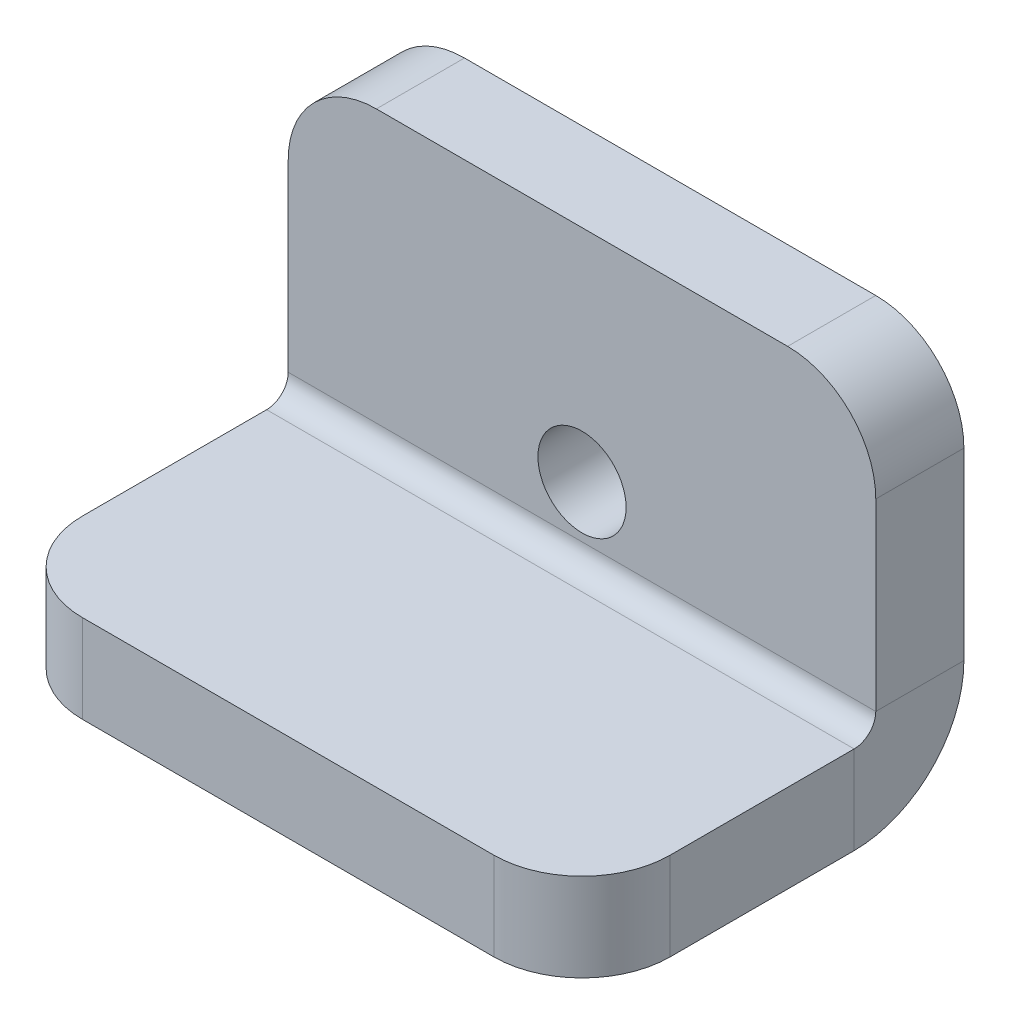
ISO-10303-21;
HEADER;
FILE_DESCRIPTION(('STEP AP214'),'2;1');
FILE_NAME('part.step','',(''),(''),'','','');
FILE_SCHEMA(('AUTOMOTIVE_DESIGN { 1 0 10303 214 1 1 1 1 }'));
ENDSEC;
DATA;
#1=APPLICATION_CONTEXT('core data for automotive mechanical design processes');
#2=APPLICATION_PROTOCOL_DEFINITION('international standard','automotive_design',2000,#1);
#3=PRODUCT_CONTEXT('',#1,'mechanical');
#4=PRODUCT('Part','Part','',(#3));
#5=PRODUCT_RELATED_PRODUCT_CATEGORY('part','',(#4));
#6=PRODUCT_DEFINITION_FORMATION('','',#4);
#7=PRODUCT_DEFINITION_CONTEXT('part definition',#1,'design');
#8=PRODUCT_DEFINITION('design','',#6,#7);
#9=PRODUCT_DEFINITION_SHAPE('','',#8);
#10=(LENGTH_UNIT() NAMED_UNIT(*) SI_UNIT(.MILLI.,.METRE.));
#11=(NAMED_UNIT(*) PLANE_ANGLE_UNIT() SI_UNIT($,.RADIAN.));
#12=(NAMED_UNIT(*) SI_UNIT($,.STERADIAN.) SOLID_ANGLE_UNIT());
#13=UNCERTAINTY_MEASURE_WITH_UNIT(LENGTH_MEASURE(1.E-05),#10,'distance_accuracy_value','');
#14=(GEOMETRIC_REPRESENTATION_CONTEXT(3) GLOBAL_UNCERTAINTY_ASSIGNED_CONTEXT((#13)) GLOBAL_UNIT_ASSIGNED_CONTEXT((#10,
#11,#12)) REPRESENTATION_CONTEXT('',''));
#15=CARTESIAN_POINT('',(0.,0.,0.));
#16=DIRECTION('',(0.,0.,1.));
#17=DIRECTION('',(1.,0.,0.));
#18=AXIS2_PLACEMENT_3D('',#15,#16,#17);
#19=CARTESIAN_POINT('',(20.,0.7366,-10.));
#20=DIRECTION('',(1.,0.,0.));
#21=DIRECTION('',(0.,0.,-1.));
#22=AXIS2_PLACEMENT_3D('',#19,#20,#21);
#23=PLANE('',#22);
#24=DIRECTION('',(0.,0.,-1.));
#25=VECTOR('',#24,1.);
#26=CARTESIAN_POINT('',(20.,0.7366,-10.));
#27=LINE('',#26,#25);
#28=CARTESIAN_POINT('',(20.,0.7366,-10.));
#29=VERTEX_POINT('',#28);
#30=CARTESIAN_POINT('',(20.,0.7366,-13.));
#31=VERTEX_POINT('',#30);
#32=EDGE_CURVE('E125',#29,#31,#27,.T.);
#33=ORIENTED_EDGE('',*,*,#32,.F.);
#34=CARTESIAN_POINT('',(20.,0.7366,-9.2634));
#35=DIRECTION('',(-1.,0.,0.));
#36=DIRECTION('',(0.,0.,1.));
#37=AXIS2_PLACEMENT_3D('',#34,#35,#36);
#38=CIRCLE('',#37,0.7366);
#39=CARTESIAN_POINT('',(20.,0.,-9.2634));
#40=VERTEX_POINT('',#39);
#41=EDGE_CURVE('E129',#40,#29,#38,.F.);
#42=ORIENTED_EDGE('',*,*,#41,.F.);
#43=DIRECTION('',(0.,1.,0.));
#44=VECTOR('',#43,1.);
#45=CARTESIAN_POINT('',(20.,-3.,-9.2634));
#46=LINE('',#45,#44);
#47=CARTESIAN_POINT('',(20.,-3.,-9.2634));
#48=VERTEX_POINT('',#47);
#49=EDGE_CURVE('E137',#48,#40,#46,.T.);
#50=ORIENTED_EDGE('',*,*,#49,.F.);
#51=CARTESIAN_POINT('',(20.,0.7366,-9.2634));
#52=DIRECTION('',(1.,0.,0.));
#53=DIRECTION('',(0.,0.,-1.));
#54=AXIS2_PLACEMENT_3D('',#51,#52,#53);
#55=CIRCLE('',#54,3.7366);
#56=EDGE_CURVE('E131',#48,#31,#55,.T.);
#57=ORIENTED_EDGE('',*,*,#56,.T.);
#58=EDGE_LOOP('',(#33,#42,#50,#57));
#59=FACE_BOUND('',#58,.T.);
#60=ADVANCED_FACE('F35',(#59),#23,.T.);
#61=CARTESIAN_POINT('',(20.,-3.,-9.2634));
#62=DIRECTION('',(1.,0.,0.));
#63=DIRECTION('',(0.,0.,-1.));
#64=AXIS2_PLACEMENT_3D('',#61,#62,#63);
#65=PLANE('',#64);
#66=DIRECTION('',(0.,1.,0.));
#67=VECTOR('',#66,1.);
#68=CARTESIAN_POINT('',(20.,0.,-13.));
#69=LINE('',#68,#67);
#70=CARTESIAN_POINT('',(20.,7.,-13.));
#71=VERTEX_POINT('',#70);
#72=EDGE_CURVE('E158',#31,#71,#69,.T.);
#73=ORIENTED_EDGE('',*,*,#72,.T.);
#74=DIRECTION('',(0.,0.,-1.));
#75=VECTOR('',#74,1.);
#76=CARTESIAN_POINT('',(20.,7.,-9.2634));
#77=LINE('',#76,#75);
#78=CARTESIAN_POINT('',(20.,7.,-10.));
#79=VERTEX_POINT('',#78);
#80=EDGE_CURVE('E11',#71,#79,#77,.F.);
#81=ORIENTED_EDGE('',*,*,#80,.T.);
#82=DIRECTION('',(0.,1.,0.));
#83=VECTOR('',#82,1.);
#84=CARTESIAN_POINT('',(20.,0.,-10.));
#85=LINE('',#84,#83);
#86=EDGE_CURVE('E146',#29,#79,#85,.T.);
#87=ORIENTED_EDGE('',*,*,#86,.F.);
#88=ORIENTED_EDGE('',*,*,#32,.T.);
#89=EDGE_LOOP('',(#73,#81,#87,#88));
#90=FACE_BOUND('',#89,.T.);
#91=ADVANCED_FACE('F156',(#90),#65,.T.);
#92=CARTESIAN_POINT('',(0.,0.,-9.2634));
#93=DIRECTION('',(-1.,0.,0.));
#94=DIRECTION('',(0.,0.,1.));
#95=AXIS2_PLACEMENT_3D('',#92,#93,#94);
#96=PLANE('',#95);
#97=DIRECTION('',(0.,-1.,0.));
#98=VECTOR('',#97,1.);
#99=CARTESIAN_POINT('',(0.,0.,-9.2634));
#100=LINE('',#99,#98);
#101=CARTESIAN_POINT('',(0.,0.,-9.2634));
#102=VERTEX_POINT('',#101);
#103=CARTESIAN_POINT('',(0.,-3.,-9.2634));
#104=VERTEX_POINT('',#103);
#105=EDGE_CURVE('E202',#102,#104,#100,.T.);
#106=ORIENTED_EDGE('',*,*,#105,.F.);
#107=CARTESIAN_POINT('',(0.,0.7366,-9.2634));
#108=DIRECTION('',(-1.,0.,0.));
#109=DIRECTION('',(0.,0.,1.));
#110=AXIS2_PLACEMENT_3D('',#107,#108,#109);
#111=CIRCLE('',#110,0.7366);
#112=CARTESIAN_POINT('',(0.,0.7366,-10.));
#113=VERTEX_POINT('',#112);
#114=EDGE_CURVE('E177',#102,#113,#111,.F.);
#115=ORIENTED_EDGE('',*,*,#114,.T.);
#116=DIRECTION('',(0.,0.,1.));
#117=VECTOR('',#116,1.);
#118=CARTESIAN_POINT('',(0.,0.7366,-13.));
#119=LINE('',#118,#117);
#120=CARTESIAN_POINT('',(0.,0.7366,-13.));
#121=VERTEX_POINT('',#120);
#122=EDGE_CURVE('E200',#121,#113,#119,.T.);
#123=ORIENTED_EDGE('',*,*,#122,.F.);
#124=CARTESIAN_POINT('',(0.,0.7366,-9.2634));
#125=DIRECTION('',(1.,0.,0.));
#126=DIRECTION('',(0.,0.,-1.));
#127=AXIS2_PLACEMENT_3D('',#124,#125,#126);
#128=CIRCLE('',#127,3.7366);
#129=EDGE_CURVE('E183',#104,#121,#128,.T.);
#130=ORIENTED_EDGE('',*,*,#129,.F.);
#131=EDGE_LOOP('',(#106,#115,#123,#130));
#132=FACE_BOUND('',#131,.T.);
#133=ADVANCED_FACE('F284',(#132),#96,.T.);
#134=CARTESIAN_POINT('',(0.,0.7366,-13.));
#135=DIRECTION('',(-1.,0.,0.));
#136=DIRECTION('',(0.,0.,1.));
#137=AXIS2_PLACEMENT_3D('',#134,#135,#136);
#138=PLANE('',#137);
#139=DIRECTION('',(0.,0.,-1.));
#140=VECTOR('',#139,1.);
#141=CARTESIAN_POINT('',(0.,-3.,0.));
#142=LINE('',#141,#140);
#143=CARTESIAN_POINT('',(0.,-3.,-3.));
#144=VERTEX_POINT('',#143);
#145=EDGE_CURVE('E181',#144,#104,#142,.T.);
#146=ORIENTED_EDGE('',*,*,#145,.F.);
#147=DIRECTION('',(0.,1.,0.));
#148=VECTOR('',#147,1.);
#149=CARTESIAN_POINT('',(0.,0.7366,-3.));
#150=LINE('',#149,#148);
#151=CARTESIAN_POINT('',(0.,0.,-3.));
#152=VERTEX_POINT('',#151);
#153=EDGE_CURVE('E222',#144,#152,#150,.T.);
#154=ORIENTED_EDGE('',*,*,#153,.T.);
#155=DIRECTION('',(0.,0.,-1.));
#156=VECTOR('',#155,1.);
#157=CARTESIAN_POINT('',(0.,0.,0.));
#158=LINE('',#157,#156);
#159=EDGE_CURVE('E179',#152,#102,#158,.T.);
#160=ORIENTED_EDGE('',*,*,#159,.T.);
#161=ORIENTED_EDGE('',*,*,#105,.T.);
#162=EDGE_LOOP('',(#146,#154,#160,#161));
#163=FACE_BOUND('',#162,.T.);
#164=ADVANCED_FACE('F244',(#163),#138,.T.);
#165=CARTESIAN_POINT('',(20.,0.,-13.));
#166=DIRECTION('',(0.,0.,1.));
#167=DIRECTION('',(1.,0.,0.));
#168=AXIS2_PLACEMENT_3D('',#165,#166,#167);
#169=PLANE('',#168);
#170=CARTESIAN_POINT('',(10.,2.5,-13.));
#171=DIRECTION('',(0.,0.,-1.));
#172=DIRECTION('',(-1.,0.,0.));
#173=AXIS2_PLACEMENT_3D('',#170,#171,#172);
#174=CIRCLE('',#173,1.5);
#175=CARTESIAN_POINT('',(8.5,2.5,-13.));
#176=VERTEX_POINT('',#175);
#177=EDGE_CURVE('E268',#176,#176,#174,.T.);
#178=ORIENTED_EDGE('',*,*,#177,.F.);
#179=EDGE_LOOP('',(#178));
#180=FACE_BOUND('',#179,.T.);
#181=DIRECTION('',(0.,1.,0.));
#182=VECTOR('',#181,1.);
#183=CARTESIAN_POINT('',(0.,0.,-13.));
#184=LINE('',#183,#182);
#185=CARTESIAN_POINT('',(0.,7.,-13.));
#186=VERTEX_POINT('',#185);
#187=EDGE_CURVE('E172',#121,#186,#184,.T.);
#188=ORIENTED_EDGE('',*,*,#187,.T.);
#189=CARTESIAN_POINT('',(3.,7.,-13.));
#190=DIRECTION('',(0.,0.,1.));
#191=DIRECTION('',(1.,0.,0.));
#192=AXIS2_PLACEMENT_3D('',#189,#190,#191);
#193=CIRCLE('',#192,3.);
#194=CARTESIAN_POINT('',(3.,10.,-13.));
#195=VERTEX_POINT('',#194);
#196=EDGE_CURVE('E211',#186,#195,#193,.F.);
#197=ORIENTED_EDGE('',*,*,#196,.T.);
#198=DIRECTION('',(-1.,0.,0.));
#199=VECTOR('',#198,1.);
#200=CARTESIAN_POINT('',(20.,10.,-13.));
#201=LINE('',#200,#199);
#202=CARTESIAN_POINT('',(17.,10.,-13.));
#203=VERTEX_POINT('',#202);
#204=EDGE_CURVE('E197',#203,#195,#201,.T.);
#205=ORIENTED_EDGE('',*,*,#204,.F.);
#206=CARTESIAN_POINT('',(17.,7.,-13.));
#207=DIRECTION('',(0.,0.,1.));
#208=DIRECTION('',(1.,0.,0.));
#209=AXIS2_PLACEMENT_3D('',#206,#207,#208);
#210=CIRCLE('',#209,3.);
#211=EDGE_CURVE('E209',#203,#71,#210,.F.);
#212=ORIENTED_EDGE('',*,*,#211,.T.);
#213=ORIENTED_EDGE('',*,*,#72,.F.);
#214=DIRECTION('',(-1.,0.,0.));
#215=VECTOR('',#214,1.);
#216=CARTESIAN_POINT('',(20.,0.7366,-13.));
#217=LINE('',#216,#215);
#218=EDGE_CURVE('E171',#31,#121,#217,.T.);
#219=ORIENTED_EDGE('',*,*,#218,.T.);
#220=EDGE_LOOP('',(#188,#197,#205,#212,#213,#219));
#221=FACE_BOUND('',#220,.T.);
#222=ADVANCED_FACE('F263',(#180,#221),#169,.F.);
#223=CARTESIAN_POINT('',(20.,10.,-10.));
#224=DIRECTION('',(0.,1.,0.));
#225=DIRECTION('',(0.,0.,1.));
#226=AXIS2_PLACEMENT_3D('',#223,#224,#225);
#227=PLANE('',#226);
#228=ORIENTED_EDGE('',*,*,#204,.T.);
#229=DIRECTION('',(0.,0.,-1.));
#230=VECTOR('',#229,1.);
#231=CARTESIAN_POINT('',(3.,10.,-10.));
#232=LINE('',#231,#230);
#233=CARTESIAN_POINT('',(3.,10.,-10.));
#234=VERTEX_POINT('',#233);
#235=EDGE_CURVE('E216',#195,#234,#232,.F.);
#236=ORIENTED_EDGE('',*,*,#235,.T.);
#237=DIRECTION('',(-1.,0.,0.));
#238=VECTOR('',#237,1.);
#239=CARTESIAN_POINT('',(20.,10.,-10.));
#240=LINE('',#239,#238);
#241=CARTESIAN_POINT('',(17.,10.,-10.));
#242=VERTEX_POINT('',#241);
#243=EDGE_CURVE('E153',#242,#234,#240,.T.);
#244=ORIENTED_EDGE('',*,*,#243,.F.);
#245=DIRECTION('',(0.,0.,-1.));
#246=VECTOR('',#245,1.);
#247=CARTESIAN_POINT('',(17.,10.,-10.));
#248=LINE('',#247,#246);
#249=EDGE_CURVE('E213',#242,#203,#248,.T.);
#250=ORIENTED_EDGE('',*,*,#249,.T.);
#251=EDGE_LOOP('',(#228,#236,#244,#250));
#252=FACE_BOUND('',#251,.T.);
#253=ADVANCED_FACE('F276',(#252),#227,.T.);
#254=CARTESIAN_POINT('',(20.,0.,-10.));
#255=DIRECTION('',(0.,0.,1.));
#256=DIRECTION('',(1.,0.,0.));
#257=AXIS2_PLACEMENT_3D('',#254,#255,#256);
#258=PLANE('',#257);
#259=CARTESIAN_POINT('',(10.,2.5,-10.));
#260=DIRECTION('',(0.,0.,1.));
#261=DIRECTION('',(1.,0.,0.));
#262=AXIS2_PLACEMENT_3D('',#259,#260,#261);
#263=CIRCLE('',#262,1.5);
#264=CARTESIAN_POINT('',(11.5,2.5,-10.));
#265=VERTEX_POINT('',#264);
#266=EDGE_CURVE('E175',#265,#265,#263,.F.);
#267=ORIENTED_EDGE('',*,*,#266,.T.);
#268=EDGE_LOOP('',(#267));
#269=FACE_BOUND('',#268,.T.);
#270=ORIENTED_EDGE('',*,*,#243,.T.);
#271=CARTESIAN_POINT('',(3.,7.,-10.));
#272=DIRECTION('',(0.,0.,1.));
#273=DIRECTION('',(1.,0.,0.));
#274=AXIS2_PLACEMENT_3D('',#271,#272,#273);
#275=CIRCLE('',#274,3.);
#276=CARTESIAN_POINT('',(0.,7.,-10.));
#277=VERTEX_POINT('',#276);
#278=EDGE_CURVE('E220',#234,#277,#275,.T.);
#279=ORIENTED_EDGE('',*,*,#278,.T.);
#280=DIRECTION('',(0.,1.,0.));
#281=VECTOR('',#280,1.);
#282=CARTESIAN_POINT('',(0.,0.,-10.));
#283=LINE('',#282,#281);
#284=EDGE_CURVE('E149',#113,#277,#283,.T.);
#285=ORIENTED_EDGE('',*,*,#284,.F.);
#286=DIRECTION('',(-1.,0.,0.));
#287=VECTOR('',#286,1.);
#288=CARTESIAN_POINT('',(20.,0.7366,-10.));
#289=LINE('',#288,#287);
#290=EDGE_CURVE('E143',#29,#113,#289,.T.);
#291=ORIENTED_EDGE('',*,*,#290,.F.);
#292=ORIENTED_EDGE('',*,*,#86,.T.);
#293=CARTESIAN_POINT('',(17.,7.,-10.));
#294=DIRECTION('',(0.,0.,1.));
#295=DIRECTION('',(1.,0.,0.));
#296=AXIS2_PLACEMENT_3D('',#293,#294,#295);
#297=CIRCLE('',#296,3.);
#298=EDGE_CURVE('E218',#79,#242,#297,.T.);
#299=ORIENTED_EDGE('',*,*,#298,.T.);
#300=EDGE_LOOP('',(#270,#279,#285,#291,#292,#299));
#301=FACE_BOUND('',#300,.T.);
#302=ADVANCED_FACE('F145',(#269,#301),#258,.T.);
#303=CARTESIAN_POINT('',(20.,0.7366,-9.2634));
#304=DIRECTION('',(-1.,0.,0.));
#305=DIRECTION('',(0.,0.,1.));
#306=AXIS2_PLACEMENT_3D('',#303,#304,#305);
#307=CYLINDRICAL_SURFACE('',#306,0.7366);
#308=ORIENTED_EDGE('',*,*,#114,.F.);
#309=DIRECTION('',(-1.,0.,0.));
#310=VECTOR('',#309,1.);
#311=CARTESIAN_POINT('',(20.,0.,-9.2634));
#312=LINE('',#311,#310);
#313=EDGE_CURVE('E154',#40,#102,#312,.T.);
#314=ORIENTED_EDGE('',*,*,#313,.F.);
#315=ORIENTED_EDGE('',*,*,#41,.T.);
#316=ORIENTED_EDGE('',*,*,#290,.T.);
#317=EDGE_LOOP('',(#308,#314,#315,#316));
#318=FACE_BOUND('',#317,.T.);
#319=ADVANCED_FACE('F161',(#318),#307,.F.);
#320=CARTESIAN_POINT('',(20.,0.,0.));
#321=DIRECTION('',(0.,1.,0.));
#322=DIRECTION('',(0.,0.,1.));
#323=AXIS2_PLACEMENT_3D('',#320,#321,#322);
#324=PLANE('',#323);
#325=ORIENTED_EDGE('',*,*,#159,.F.);
#326=CARTESIAN_POINT('',(3.,0.,-3.));
#327=DIRECTION('',(0.,1.,0.));
#328=DIRECTION('',(0.,0.,1.));
#329=AXIS2_PLACEMENT_3D('',#326,#327,#328);
#330=CIRCLE('',#329,3.);
#331=CARTESIAN_POINT('',(3.,0.,0.));
#332=VERTEX_POINT('',#331);
#333=EDGE_CURVE('E227',#152,#332,#330,.T.);
#334=ORIENTED_EDGE('',*,*,#333,.T.);
#335=DIRECTION('',(-1.,0.,0.));
#336=VECTOR('',#335,1.);
#337=CARTESIAN_POINT('',(20.,0.,0.));
#338=LINE('',#337,#336);
#339=CARTESIAN_POINT('',(17.,0.,0.));
#340=VERTEX_POINT('',#339);
#341=EDGE_CURVE('E193',#340,#332,#338,.T.);
#342=ORIENTED_EDGE('',*,*,#341,.F.);
#343=CARTESIAN_POINT('',(17.,0.,-3.));
#344=DIRECTION('',(0.,1.,0.));
#345=DIRECTION('',(0.,0.,1.));
#346=AXIS2_PLACEMENT_3D('',#343,#344,#345);
#347=CIRCLE('',#346,3.);
#348=CARTESIAN_POINT('',(20.,0.,-3.));
#349=VERTEX_POINT('',#348);
#350=EDGE_CURVE('E225',#340,#349,#347,.T.);
#351=ORIENTED_EDGE('',*,*,#350,.T.);
#352=DIRECTION('',(0.,0.,-1.));
#353=VECTOR('',#352,1.);
#354=CARTESIAN_POINT('',(20.,0.,0.));
#355=LINE('',#354,#353);
#356=EDGE_CURVE('E163',#349,#40,#355,.T.);
#357=ORIENTED_EDGE('',*,*,#356,.T.);
#358=ORIENTED_EDGE('',*,*,#313,.T.);
#359=EDGE_LOOP('',(#325,#334,#342,#351,#357,#358));
#360=FACE_BOUND('',#359,.T.);
#361=ADVANCED_FACE('F250',(#360),#324,.T.);
#362=CARTESIAN_POINT('',(20.,-3.,0.));
#363=DIRECTION('',(0.,0.,1.));
#364=DIRECTION('',(1.,0.,0.));
#365=AXIS2_PLACEMENT_3D('',#362,#363,#364);
#366=PLANE('',#365);
#367=ORIENTED_EDGE('',*,*,#341,.T.);
#368=DIRECTION('',(0.,1.,0.));
#369=VECTOR('',#368,1.);
#370=CARTESIAN_POINT('',(3.,-3.,0.));
#371=LINE('',#370,#369);
#372=CARTESIAN_POINT('',(3.,-3.,0.));
#373=VERTEX_POINT('',#372);
#374=EDGE_CURVE('E57',#332,#373,#371,.F.);
#375=ORIENTED_EDGE('',*,*,#374,.T.);
#376=DIRECTION('',(-1.,0.,0.));
#377=VECTOR('',#376,1.);
#378=CARTESIAN_POINT('',(20.,-3.,0.));
#379=LINE('',#378,#377);
#380=CARTESIAN_POINT('',(17.,-3.,0.));
#381=VERTEX_POINT('',#380);
#382=EDGE_CURVE('E191',#381,#373,#379,.T.);
#383=ORIENTED_EDGE('',*,*,#382,.F.);
#384=DIRECTION('',(0.,1.,0.));
#385=VECTOR('',#384,1.);
#386=CARTESIAN_POINT('',(17.,0.,0.));
#387=LINE('',#386,#385);
#388=EDGE_CURVE('E229',#381,#340,#387,.T.);
#389=ORIENTED_EDGE('',*,*,#388,.T.);
#390=EDGE_LOOP('',(#367,#375,#383,#389));
#391=FACE_BOUND('',#390,.T.);
#392=ADVANCED_FACE('F251',(#391),#366,.T.);
#393=CARTESIAN_POINT('',(20.,-3.,0.));
#394=DIRECTION('',(0.,1.,0.));
#395=DIRECTION('',(0.,0.,1.));
#396=AXIS2_PLACEMENT_3D('',#393,#394,#395);
#397=PLANE('',#396);
#398=ORIENTED_EDGE('',*,*,#382,.T.);
#399=CARTESIAN_POINT('',(3.,-3.,-3.));
#400=DIRECTION('',(0.,1.,0.));
#401=DIRECTION('',(0.,0.,1.));
#402=AXIS2_PLACEMENT_3D('',#399,#400,#401);
#403=CIRCLE('',#402,3.);
#404=EDGE_CURVE('E235',#373,#144,#403,.F.);
#405=ORIENTED_EDGE('',*,*,#404,.T.);
#406=ORIENTED_EDGE('',*,*,#145,.T.);
#407=DIRECTION('',(-1.,0.,0.));
#408=VECTOR('',#407,1.);
#409=CARTESIAN_POINT('',(20.,-3.,-9.2634));
#410=LINE('',#409,#408);
#411=EDGE_CURVE('E188',#48,#104,#410,.T.);
#412=ORIENTED_EDGE('',*,*,#411,.F.);
#413=DIRECTION('',(0.,0.,-1.));
#414=VECTOR('',#413,1.);
#415=CARTESIAN_POINT('',(20.,-3.,0.));
#416=LINE('',#415,#414);
#417=CARTESIAN_POINT('',(20.,-3.,-3.));
#418=VERTEX_POINT('',#417);
#419=EDGE_CURVE('E165',#418,#48,#416,.T.);
#420=ORIENTED_EDGE('',*,*,#419,.F.);
#421=CARTESIAN_POINT('',(17.,-3.,-3.));
#422=DIRECTION('',(0.,1.,0.));
#423=DIRECTION('',(0.,0.,1.));
#424=AXIS2_PLACEMENT_3D('',#421,#422,#423);
#425=CIRCLE('',#424,3.);
#426=EDGE_CURVE('E233',#418,#381,#425,.F.);
#427=ORIENTED_EDGE('',*,*,#426,.T.);
#428=EDGE_LOOP('',(#398,#405,#406,#412,#420,#427));
#429=FACE_BOUND('',#428,.T.);
#430=ADVANCED_FACE('F239',(#429),#397,.F.);
#431=CARTESIAN_POINT('',(20.,0.7366,-9.2634));
#432=DIRECTION('',(-1.,0.,0.));
#433=DIRECTION('',(0.,0.,1.));
#434=AXIS2_PLACEMENT_3D('',#431,#432,#433);
#435=CYLINDRICAL_SURFACE('',#434,3.7366);
#436=ORIENTED_EDGE('',*,*,#129,.T.);
#437=ORIENTED_EDGE('',*,*,#218,.F.);
#438=ORIENTED_EDGE('',*,*,#56,.F.);
#439=ORIENTED_EDGE('',*,*,#411,.T.);
#440=EDGE_LOOP('',(#436,#437,#438,#439));
#441=FACE_BOUND('',#440,.T.);
#442=ADVANCED_FACE('F259',(#441),#435,.T.);
#443=CARTESIAN_POINT('',(20.,0.7366,-9.2634));
#444=DIRECTION('',(-1.,0.,0.));
#445=DIRECTION('',(0.,0.,1.));
#446=AXIS2_PLACEMENT_3D('',#443,#444,#445);
#447=PLANE('',#446);
#448=ORIENTED_EDGE('',*,*,#356,.F.);
#449=DIRECTION('',(0.,1.,0.));
#450=VECTOR('',#449,1.);
#451=CARTESIAN_POINT('',(20.,-3.,-3.));
#452=LINE('',#451,#450);
#453=EDGE_CURVE('E43',#349,#418,#452,.F.);
#454=ORIENTED_EDGE('',*,*,#453,.T.);
#455=ORIENTED_EDGE('',*,*,#419,.T.);
#456=ORIENTED_EDGE('',*,*,#49,.T.);
#457=EDGE_LOOP('',(#448,#454,#455,#456));
#458=FACE_BOUND('',#457,.T.);
#459=ADVANCED_FACE('F256',(#458),#447,.F.);
#460=CARTESIAN_POINT('',(0.,0.7366,-9.2634));
#461=DIRECTION('',(-1.,0.,0.));
#462=DIRECTION('',(0.,0.,1.));
#463=AXIS2_PLACEMENT_3D('',#460,#461,#462);
#464=PLANE('',#463);
#465=ORIENTED_EDGE('',*,*,#284,.T.);
#466=DIRECTION('',(0.,0.,-1.));
#467=VECTOR('',#466,1.);
#468=CARTESIAN_POINT('',(0.,7.,-9.2634));
#469=LINE('',#468,#467);
#470=EDGE_CURVE('E136',#277,#186,#469,.T.);
#471=ORIENTED_EDGE('',*,*,#470,.T.);
#472=ORIENTED_EDGE('',*,*,#187,.F.);
#473=ORIENTED_EDGE('',*,*,#122,.T.);
#474=EDGE_LOOP('',(#465,#471,#472,#473));
#475=FACE_BOUND('',#474,.T.);
#476=ADVANCED_FACE('F297',(#475),#464,.T.);
#477=CARTESIAN_POINT('',(3.,7.,-9.2634));
#478=DIRECTION('',(0.,0.,-1.));
#479=DIRECTION('',(-1.,0.,0.));
#480=AXIS2_PLACEMENT_3D('',#477,#478,#479);
#481=CYLINDRICAL_SURFACE('',#480,3.);
#482=ORIENTED_EDGE('',*,*,#278,.F.);
#483=ORIENTED_EDGE('',*,*,#235,.F.);
#484=ORIENTED_EDGE('',*,*,#196,.F.);
#485=ORIENTED_EDGE('',*,*,#470,.F.);
#486=EDGE_LOOP('',(#482,#483,#484,#485));
#487=FACE_BOUND('',#486,.T.);
#488=ADVANCED_FACE('F294',(#487),#481,.T.);
#489=CARTESIAN_POINT('',(3.,0.7366,-3.));
#490=DIRECTION('',(0.,1.,0.));
#491=DIRECTION('',(0.,0.,1.));
#492=AXIS2_PLACEMENT_3D('',#489,#490,#491);
#493=CYLINDRICAL_SURFACE('',#492,3.);
#494=ORIENTED_EDGE('',*,*,#404,.F.);
#495=ORIENTED_EDGE('',*,*,#374,.F.);
#496=ORIENTED_EDGE('',*,*,#333,.F.);
#497=ORIENTED_EDGE('',*,*,#153,.F.);
#498=EDGE_LOOP('',(#494,#495,#496,#497));
#499=FACE_BOUND('',#498,.T.);
#500=ADVANCED_FACE('F247',(#499),#493,.T.);
#501=CARTESIAN_POINT('',(17.,-3.,-3.));
#502=DIRECTION('',(0.,-1.,0.));
#503=DIRECTION('',(0.,0.,-1.));
#504=AXIS2_PLACEMENT_3D('',#501,#502,#503);
#505=CYLINDRICAL_SURFACE('',#504,3.);
#506=ORIENTED_EDGE('',*,*,#426,.F.);
#507=ORIENTED_EDGE('',*,*,#453,.F.);
#508=ORIENTED_EDGE('',*,*,#350,.F.);
#509=ORIENTED_EDGE('',*,*,#388,.F.);
#510=EDGE_LOOP('',(#506,#507,#508,#509));
#511=FACE_BOUND('',#510,.T.);
#512=ADVANCED_FACE('F255',(#511),#505,.T.);
#513=CARTESIAN_POINT('',(17.,7.,-10.));
#514=DIRECTION('',(0.,0.,-1.));
#515=DIRECTION('',(-1.,0.,0.));
#516=AXIS2_PLACEMENT_3D('',#513,#514,#515);
#517=CYLINDRICAL_SURFACE('',#516,3.);
#518=ORIENTED_EDGE('',*,*,#298,.F.);
#519=ORIENTED_EDGE('',*,*,#80,.F.);
#520=ORIENTED_EDGE('',*,*,#211,.F.);
#521=ORIENTED_EDGE('',*,*,#249,.F.);
#522=EDGE_LOOP('',(#518,#519,#520,#521));
#523=FACE_BOUND('',#522,.T.);
#524=ADVANCED_FACE('F37',(#523),#517,.T.);
#525=CARTESIAN_POINT('',(10.,2.5,-5.75735931288072));
#526=DIRECTION('',(0.,0.,-1.));
#527=DIRECTION('',(-1.,0.,0.));
#528=AXIS2_PLACEMENT_3D('',#525,#526,#527);
#529=CYLINDRICAL_SURFACE('',#528,1.5);
#530=ORIENTED_EDGE('',*,*,#177,.T.);
#531=EDGE_LOOP('',(#530));
#532=FACE_BOUND('',#531,.T.);
#533=ORIENTED_EDGE('',*,*,#266,.F.);
#534=EDGE_LOOP('',(#533));
#535=FACE_BOUND('',#534,.T.);
#536=ADVANCED_FACE('F272',(#532,#535),#529,.F.);
#537=CLOSED_SHELL('',(#60,#91,#133,#164,#222,#253,#302,#319,#361,#392,#430,#442,#459,#476,#488,
#500,#512,#524,#536));
#538=MANIFOLD_SOLID_BREP('B2',#537);
#539=ADVANCED_BREP_SHAPE_REPRESENTATION('',(#18,#538),#14);
#540=SHAPE_DEFINITION_REPRESENTATION(#9,#539);
ENDSEC;
END-ISO-10303-21;
